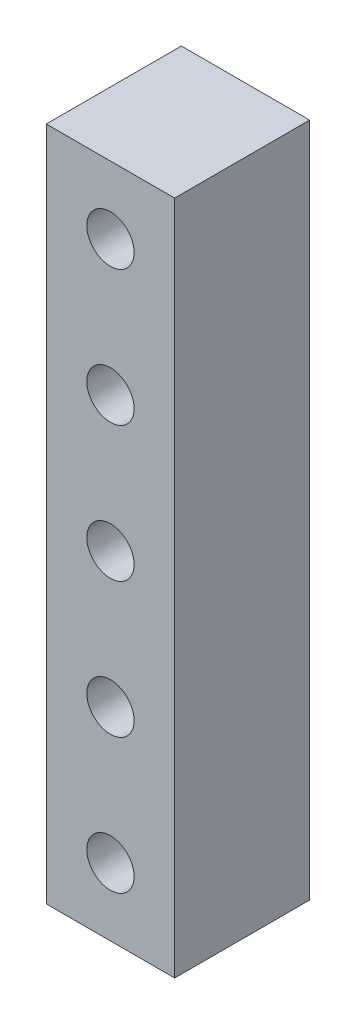
ISO-10303-21;
HEADER;
FILE_DESCRIPTION(('STEP AP214'),'2;1');
FILE_NAME('part.step','',(''),(''),'','','');
FILE_SCHEMA(('AUTOMOTIVE_DESIGN { 1 0 10303 214 1 1 1 1 }'));
ENDSEC;
DATA;
#1=APPLICATION_CONTEXT('core data for automotive mechanical design processes');
#2=APPLICATION_PROTOCOL_DEFINITION('international standard','automotive_design',2000,#1);
#3=PRODUCT_CONTEXT('',#1,'mechanical');
#4=PRODUCT('Part','Part','',(#3));
#5=PRODUCT_RELATED_PRODUCT_CATEGORY('part','',(#4));
#6=PRODUCT_DEFINITION_FORMATION('','',#4);
#7=PRODUCT_DEFINITION_CONTEXT('part definition',#1,'design');
#8=PRODUCT_DEFINITION('design','',#6,#7);
#9=PRODUCT_DEFINITION_SHAPE('','',#8);
#10=(LENGTH_UNIT() NAMED_UNIT(*) SI_UNIT(.MILLI.,.METRE.));
#11=(NAMED_UNIT(*) PLANE_ANGLE_UNIT() SI_UNIT($,.RADIAN.));
#12=(NAMED_UNIT(*) SI_UNIT($,.STERADIAN.) SOLID_ANGLE_UNIT());
#13=UNCERTAINTY_MEASURE_WITH_UNIT(LENGTH_MEASURE(1.E-05),#10,'distance_accuracy_value','');
#14=(GEOMETRIC_REPRESENTATION_CONTEXT(3) GLOBAL_UNCERTAINTY_ASSIGNED_CONTEXT((#13)) GLOBAL_UNIT_ASSIGNED_CONTEXT((#10,
#11,#12)) REPRESENTATION_CONTEXT('',''));
#15=CARTESIAN_POINT('',(0.,0.,0.));
#16=DIRECTION('',(0.,0.,1.));
#17=DIRECTION('',(1.,0.,0.));
#18=AXIS2_PLACEMENT_3D('',#15,#16,#17);
#19=CARTESIAN_POINT('',(1.2065,6.35,0.));
#20=DIRECTION('',(0.,0.,1.));
#21=DIRECTION('',(1.,0.,0.));
#22=AXIS2_PLACEMENT_3D('',#19,#20,#21);
#23=PLANE('',#22);
#24=DIRECTION('',(1.,0.,0.));
#25=VECTOR('',#24,1.);
#26=CARTESIAN_POINT('',(0.,0.,0.));
#27=LINE('',#26,#25);
#28=CARTESIAN_POINT('',(0.,0.,0.));
#29=VERTEX_POINT('',#28);
#30=CARTESIAN_POINT('',(2.413,0.,0.));
#31=VERTEX_POINT('',#30);
#32=EDGE_CURVE('E28',#29,#31,#27,.T.);
#33=ORIENTED_EDGE('',*,*,#32,.F.);
#34=DIRECTION('',(0.,-1.,0.));
#35=VECTOR('',#34,1.);
#36=CARTESIAN_POINT('',(0.,12.7,0.));
#37=LINE('',#36,#35);
#38=CARTESIAN_POINT('',(0.,12.7,0.));
#39=VERTEX_POINT('',#38);
#40=EDGE_CURVE('E158',#39,#29,#37,.T.);
#41=ORIENTED_EDGE('',*,*,#40,.F.);
#42=DIRECTION('',(-1.,0.,0.));
#43=VECTOR('',#42,1.);
#44=CARTESIAN_POINT('',(2.413,12.7,0.));
#45=LINE('',#44,#43);
#46=CARTESIAN_POINT('',(2.413,12.7,0.));
#47=VERTEX_POINT('',#46);
#48=EDGE_CURVE('E135',#47,#39,#45,.T.);
#49=ORIENTED_EDGE('',*,*,#48,.F.);
#50=DIRECTION('',(0.,1.,0.));
#51=VECTOR('',#50,1.);
#52=CARTESIAN_POINT('',(2.413,0.,0.));
#53=LINE('',#52,#51);
#54=EDGE_CURVE('E21',#31,#47,#53,.T.);
#55=ORIENTED_EDGE('',*,*,#54,.F.);
#56=EDGE_LOOP('',(#33,#41,#49,#55));
#57=FACE_BOUND('',#56,.T.);
#58=CARTESIAN_POINT('',(1.2065,11.43,0.));
#59=DIRECTION('',(0.,0.,1.));
#60=DIRECTION('',(-1.,0.,0.));
#61=AXIS2_PLACEMENT_3D('',#58,#59,#60);
#62=CIRCLE('',#61,0.4445);
#63=CARTESIAN_POINT('',(1.651,11.43,0.));
#64=VERTEX_POINT('',#63);
#65=EDGE_CURVE('E133',#64,#64,#62,.T.);
#66=ORIENTED_EDGE('',*,*,#65,.T.);
#67=EDGE_LOOP('',(#66));
#68=FACE_BOUND('',#67,.T.);
#69=CARTESIAN_POINT('',(1.2065,8.89,0.));
#70=DIRECTION('',(0.,0.,1.));
#71=DIRECTION('',(-1.,0.,0.));
#72=AXIS2_PLACEMENT_3D('',#69,#70,#71);
#73=CIRCLE('',#72,0.4445);
#74=CARTESIAN_POINT('',(1.651,8.89,0.));
#75=VERTEX_POINT('',#74);
#76=EDGE_CURVE('E134',#75,#75,#73,.T.);
#77=ORIENTED_EDGE('',*,*,#76,.T.);
#78=EDGE_LOOP('',(#77));
#79=FACE_BOUND('',#78,.T.);
#80=CARTESIAN_POINT('',(1.2065,6.35,0.));
#81=DIRECTION('',(0.,0.,1.));
#82=DIRECTION('',(-1.,0.,0.));
#83=AXIS2_PLACEMENT_3D('',#80,#81,#82);
#84=CIRCLE('',#83,0.4445);
#85=CARTESIAN_POINT('',(1.651,6.35,0.));
#86=VERTEX_POINT('',#85);
#87=EDGE_CURVE('E125',#86,#86,#84,.T.);
#88=ORIENTED_EDGE('',*,*,#87,.T.);
#89=EDGE_LOOP('',(#88));
#90=FACE_BOUND('',#89,.T.);
#91=CARTESIAN_POINT('',(1.2065,3.81,0.));
#92=DIRECTION('',(0.,0.,1.));
#93=DIRECTION('',(-1.,0.,0.));
#94=AXIS2_PLACEMENT_3D('',#91,#92,#93);
#95=CIRCLE('',#94,0.4445);
#96=CARTESIAN_POINT('',(1.651,3.81,0.));
#97=VERTEX_POINT('',#96);
#98=EDGE_CURVE('E114',#97,#97,#95,.T.);
#99=ORIENTED_EDGE('',*,*,#98,.T.);
#100=EDGE_LOOP('',(#99));
#101=FACE_BOUND('',#100,.T.);
#102=CARTESIAN_POINT('',(1.2065,1.27,0.));
#103=DIRECTION('',(0.,0.,1.));
#104=DIRECTION('',(-1.,0.,0.));
#105=AXIS2_PLACEMENT_3D('',#102,#103,#104);
#106=CIRCLE('',#105,0.4445);
#107=CARTESIAN_POINT('',(1.651,1.27,0.));
#108=VERTEX_POINT('',#107);
#109=EDGE_CURVE('E105',#108,#108,#106,.T.);
#110=ORIENTED_EDGE('',*,*,#109,.T.);
#111=EDGE_LOOP('',(#110));
#112=FACE_BOUND('',#111,.T.);
#113=ADVANCED_FACE('F17',(#57,#68,#79,#90,#101,#112),#23,.F.);
#114=CARTESIAN_POINT('',(1.2065,6.35,2.54));
#115=DIRECTION('',(0.,0.,1.));
#116=DIRECTION('',(1.,0.,0.));
#117=AXIS2_PLACEMENT_3D('',#114,#115,#116);
#118=PLANE('',#117);
#119=DIRECTION('',(1.,0.,0.));
#120=VECTOR('',#119,1.);
#121=CARTESIAN_POINT('',(0.,0.,2.54));
#122=LINE('',#121,#120);
#123=CARTESIAN_POINT('',(0.,0.,2.54));
#124=VERTEX_POINT('',#123);
#125=CARTESIAN_POINT('',(2.413,0.,2.54));
#126=VERTEX_POINT('',#125);
#127=EDGE_CURVE('E11',#124,#126,#122,.T.);
#128=ORIENTED_EDGE('',*,*,#127,.T.);
#129=DIRECTION('',(0.,1.,0.));
#130=VECTOR('',#129,1.);
#131=CARTESIAN_POINT('',(2.413,0.,2.54));
#132=LINE('',#131,#130);
#133=CARTESIAN_POINT('',(2.413,12.7,2.54));
#134=VERTEX_POINT('',#133);
#135=EDGE_CURVE('E126',#126,#134,#132,.T.);
#136=ORIENTED_EDGE('',*,*,#135,.T.);
#137=DIRECTION('',(-1.,0.,0.));
#138=VECTOR('',#137,1.);
#139=CARTESIAN_POINT('',(2.413,12.7,2.54));
#140=LINE('',#139,#138);
#141=CARTESIAN_POINT('',(0.,12.7,2.54));
#142=VERTEX_POINT('',#141);
#143=EDGE_CURVE('E137',#134,#142,#140,.T.);
#144=ORIENTED_EDGE('',*,*,#143,.T.);
#145=DIRECTION('',(0.,-1.,0.));
#146=VECTOR('',#145,1.);
#147=CARTESIAN_POINT('',(0.,12.7,2.54));
#148=LINE('',#147,#146);
#149=EDGE_CURVE('E145',#142,#124,#148,.T.);
#150=ORIENTED_EDGE('',*,*,#149,.T.);
#151=EDGE_LOOP('',(#128,#136,#144,#150));
#152=FACE_BOUND('',#151,.T.);
#153=CARTESIAN_POINT('',(1.2065,11.43,2.54));
#154=DIRECTION('',(0.,0.,-1.));
#155=DIRECTION('',(-1.,0.,0.));
#156=AXIS2_PLACEMENT_3D('',#153,#154,#155);
#157=CIRCLE('',#156,0.4445);
#158=CARTESIAN_POINT('',(1.651,11.43,2.54));
#159=VERTEX_POINT('',#158);
#160=EDGE_CURVE('E130',#159,#159,#157,.T.);
#161=ORIENTED_EDGE('',*,*,#160,.T.);
#162=EDGE_LOOP('',(#161));
#163=FACE_BOUND('',#162,.T.);
#164=CARTESIAN_POINT('',(1.2065,8.89,2.54));
#165=DIRECTION('',(0.,0.,-1.));
#166=DIRECTION('',(-1.,0.,0.));
#167=AXIS2_PLACEMENT_3D('',#164,#165,#166);
#168=CIRCLE('',#167,0.4445);
#169=CARTESIAN_POINT('',(1.651,8.89,2.54));
#170=VERTEX_POINT('',#169);
#171=EDGE_CURVE('E162',#170,#170,#168,.T.);
#172=ORIENTED_EDGE('',*,*,#171,.T.);
#173=EDGE_LOOP('',(#172));
#174=FACE_BOUND('',#173,.T.);
#175=CARTESIAN_POINT('',(1.2065,6.35,2.54));
#176=DIRECTION('',(0.,0.,-1.));
#177=DIRECTION('',(-1.,0.,0.));
#178=AXIS2_PLACEMENT_3D('',#175,#176,#177);
#179=CIRCLE('',#178,0.4445);
#180=CARTESIAN_POINT('',(1.651,6.35,2.54));
#181=VERTEX_POINT('',#180);
#182=EDGE_CURVE('E122',#181,#181,#179,.T.);
#183=ORIENTED_EDGE('',*,*,#182,.T.);
#184=EDGE_LOOP('',(#183));
#185=FACE_BOUND('',#184,.T.);
#186=CARTESIAN_POINT('',(1.2065,3.81,2.54));
#187=DIRECTION('',(0.,0.,-1.));
#188=DIRECTION('',(-1.,0.,0.));
#189=AXIS2_PLACEMENT_3D('',#186,#187,#188);
#190=CIRCLE('',#189,0.4445);
#191=CARTESIAN_POINT('',(1.651,3.81,2.54));
#192=VERTEX_POINT('',#191);
#193=EDGE_CURVE('E108',#192,#192,#190,.T.);
#194=ORIENTED_EDGE('',*,*,#193,.T.);
#195=EDGE_LOOP('',(#194));
#196=FACE_BOUND('',#195,.T.);
#197=CARTESIAN_POINT('',(1.2065,1.27,2.54));
#198=DIRECTION('',(0.,0.,-1.));
#199=DIRECTION('',(-1.,0.,0.));
#200=AXIS2_PLACEMENT_3D('',#197,#198,#199);
#201=CIRCLE('',#200,0.4445);
#202=CARTESIAN_POINT('',(1.651,1.27,2.54));
#203=VERTEX_POINT('',#202);
#204=EDGE_CURVE('E109',#203,#203,#201,.T.);
#205=ORIENTED_EDGE('',*,*,#204,.T.);
#206=EDGE_LOOP('',(#205));
#207=FACE_BOUND('',#206,.T.);
#208=ADVANCED_FACE('F181',(#152,#163,#174,#185,#196,#207),#118,.T.);
#209=CARTESIAN_POINT('',(0.,0.,0.));
#210=DIRECTION('',(0.,-1.,0.));
#211=DIRECTION('',(0.,0.,-1.));
#212=AXIS2_PLACEMENT_3D('',#209,#210,#211);
#213=PLANE('',#212);
#214=ORIENTED_EDGE('',*,*,#32,.T.);
#215=DIRECTION('',(0.,0.,1.));
#216=VECTOR('',#215,1.);
#217=CARTESIAN_POINT('',(2.413,0.,0.));
#218=LINE('',#217,#216);
#219=EDGE_CURVE('E129',#31,#126,#218,.T.);
#220=ORIENTED_EDGE('',*,*,#219,.T.);
#221=ORIENTED_EDGE('',*,*,#127,.F.);
#222=DIRECTION('',(0.,0.,1.));
#223=VECTOR('',#222,1.);
#224=CARTESIAN_POINT('',(0.,0.,0.));
#225=LINE('',#224,#223);
#226=EDGE_CURVE('E119',#29,#124,#225,.T.);
#227=ORIENTED_EDGE('',*,*,#226,.F.);
#228=EDGE_LOOP('',(#214,#220,#221,#227));
#229=FACE_BOUND('',#228,.T.);
#230=ADVANCED_FACE('F184',(#229),#213,.T.);
#231=CARTESIAN_POINT('',(2.413,0.,0.));
#232=DIRECTION('',(1.,0.,0.));
#233=DIRECTION('',(0.,1.,0.));
#234=AXIS2_PLACEMENT_3D('',#231,#232,#233);
#235=PLANE('',#234);
#236=ORIENTED_EDGE('',*,*,#54,.T.);
#237=DIRECTION('',(0.,0.,1.));
#238=VECTOR('',#237,1.);
#239=CARTESIAN_POINT('',(2.413,12.7,0.));
#240=LINE('',#239,#238);
#241=EDGE_CURVE('E140',#47,#134,#240,.T.);
#242=ORIENTED_EDGE('',*,*,#241,.T.);
#243=ORIENTED_EDGE('',*,*,#135,.F.);
#244=ORIENTED_EDGE('',*,*,#219,.F.);
#245=EDGE_LOOP('',(#236,#242,#243,#244));
#246=FACE_BOUND('',#245,.T.);
#247=ADVANCED_FACE('F242',(#246),#235,.T.);
#248=CARTESIAN_POINT('',(2.413,12.7,0.));
#249=DIRECTION('',(0.,1.,0.));
#250=DIRECTION('',(1.,0.,0.));
#251=AXIS2_PLACEMENT_3D('',#248,#249,#250);
#252=PLANE('',#251);
#253=ORIENTED_EDGE('',*,*,#48,.T.);
#254=DIRECTION('',(0.,0.,1.));
#255=VECTOR('',#254,1.);
#256=CARTESIAN_POINT('',(0.,12.7,0.));
#257=LINE('',#256,#255);
#258=EDGE_CURVE('E138',#39,#142,#257,.T.);
#259=ORIENTED_EDGE('',*,*,#258,.T.);
#260=ORIENTED_EDGE('',*,*,#143,.F.);
#261=ORIENTED_EDGE('',*,*,#241,.F.);
#262=EDGE_LOOP('',(#253,#259,#260,#261));
#263=FACE_BOUND('',#262,.T.);
#264=ADVANCED_FACE('F19',(#263),#252,.T.);
#265=CARTESIAN_POINT('',(0.,12.7,0.));
#266=DIRECTION('',(-1.,0.,0.));
#267=DIRECTION('',(0.,0.,1.));
#268=AXIS2_PLACEMENT_3D('',#265,#266,#267);
#269=PLANE('',#268);
#270=ORIENTED_EDGE('',*,*,#40,.T.);
#271=ORIENTED_EDGE('',*,*,#226,.T.);
#272=ORIENTED_EDGE('',*,*,#149,.F.);
#273=ORIENTED_EDGE('',*,*,#258,.F.);
#274=EDGE_LOOP('',(#270,#271,#272,#273));
#275=FACE_BOUND('',#274,.T.);
#276=ADVANCED_FACE('F203',(#275),#269,.T.);
#277=CARTESIAN_POINT('',(1.2065,11.43,0.));
#278=DIRECTION('',(0.,0.,1.));
#279=DIRECTION('',(-1.,0.,0.));
#280=AXIS2_PLACEMENT_3D('',#277,#278,#279);
#281=CYLINDRICAL_SURFACE('',#280,0.4445);
#282=ORIENTED_EDGE('',*,*,#65,.F.);
#283=EDGE_LOOP('',(#282));
#284=FACE_BOUND('',#283,.T.);
#285=ORIENTED_EDGE('',*,*,#160,.F.);
#286=EDGE_LOOP('',(#285));
#287=FACE_BOUND('',#286,.T.);
#288=ADVANCED_FACE('F206',(#284,#287),#281,.F.);
#289=CARTESIAN_POINT('',(1.2065,8.89,0.));
#290=DIRECTION('',(0.,0.,1.));
#291=DIRECTION('',(-1.,0.,0.));
#292=AXIS2_PLACEMENT_3D('',#289,#290,#291);
#293=CYLINDRICAL_SURFACE('',#292,0.4445);
#294=ORIENTED_EDGE('',*,*,#76,.F.);
#295=EDGE_LOOP('',(#294));
#296=FACE_BOUND('',#295,.T.);
#297=ORIENTED_EDGE('',*,*,#171,.F.);
#298=EDGE_LOOP('',(#297));
#299=FACE_BOUND('',#298,.T.);
#300=ADVANCED_FACE('F209',(#296,#299),#293,.F.);
#301=CARTESIAN_POINT('',(1.2065,6.35,0.));
#302=DIRECTION('',(0.,0.,1.));
#303=DIRECTION('',(-1.,0.,0.));
#304=AXIS2_PLACEMENT_3D('',#301,#302,#303);
#305=CYLINDRICAL_SURFACE('',#304,0.4445);
#306=ORIENTED_EDGE('',*,*,#87,.F.);
#307=EDGE_LOOP('',(#306));
#308=FACE_BOUND('',#307,.T.);
#309=ORIENTED_EDGE('',*,*,#182,.F.);
#310=EDGE_LOOP('',(#309));
#311=FACE_BOUND('',#310,.T.);
#312=ADVANCED_FACE('F178',(#308,#311),#305,.F.);
#313=CARTESIAN_POINT('',(1.2065,3.81,0.));
#314=DIRECTION('',(0.,0.,1.));
#315=DIRECTION('',(-1.,0.,0.));
#316=AXIS2_PLACEMENT_3D('',#313,#314,#315);
#317=CYLINDRICAL_SURFACE('',#316,0.4445);
#318=ORIENTED_EDGE('',*,*,#98,.F.);
#319=EDGE_LOOP('',(#318));
#320=FACE_BOUND('',#319,.T.);
#321=ORIENTED_EDGE('',*,*,#193,.F.);
#322=EDGE_LOOP('',(#321));
#323=FACE_BOUND('',#322,.T.);
#324=ADVANCED_FACE('F174',(#320,#323),#317,.F.);
#325=CARTESIAN_POINT('',(1.2065,1.27,0.));
#326=DIRECTION('',(0.,0.,1.));
#327=DIRECTION('',(-1.,0.,0.));
#328=AXIS2_PLACEMENT_3D('',#325,#326,#327);
#329=CYLINDRICAL_SURFACE('',#328,0.4445);
#330=ORIENTED_EDGE('',*,*,#109,.F.);
#331=EDGE_LOOP('',(#330));
#332=FACE_BOUND('',#331,.T.);
#333=ORIENTED_EDGE('',*,*,#204,.F.);
#334=EDGE_LOOP('',(#333));
#335=FACE_BOUND('',#334,.T.);
#336=ADVANCED_FACE('F177',(#332,#335),#329,.F.);
#337=CLOSED_SHELL('',(#113,#208,#230,#247,#264,#276,#288,#300,#312,#324,#336));
#338=MANIFOLD_SOLID_BREP('B1',#337);
#339=ADVANCED_BREP_SHAPE_REPRESENTATION('',(#18,#338),#14);
#340=SHAPE_DEFINITION_REPRESENTATION(#9,#339);
ENDSEC;
END-ISO-10303-21;
